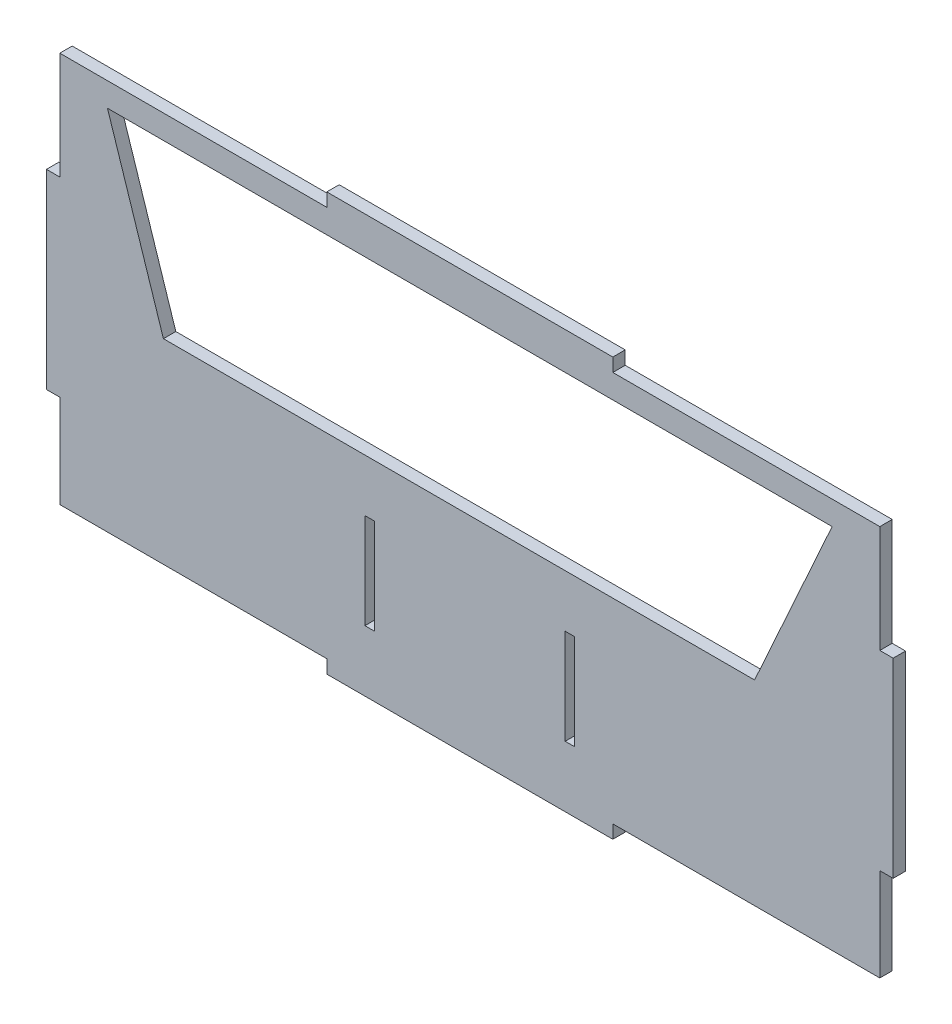
ISO-10303-21;
HEADER;
FILE_DESCRIPTION(('STEP AP214'),'2;1');
FILE_NAME('part.step','',(''),(''),'','','');
FILE_SCHEMA(('AUTOMOTIVE_DESIGN { 1 0 10303 214 1 1 1 1 }'));
ENDSEC;
DATA;
#1=APPLICATION_CONTEXT('core data for automotive mechanical design processes');
#2=APPLICATION_PROTOCOL_DEFINITION('international standard','automotive_design',2000,#1);
#3=PRODUCT_CONTEXT('',#1,'mechanical');
#4=PRODUCT('Part','Part','',(#3));
#5=PRODUCT_RELATED_PRODUCT_CATEGORY('part','',(#4));
#6=PRODUCT_DEFINITION_FORMATION('','',#4);
#7=PRODUCT_DEFINITION_CONTEXT('part definition',#1,'design');
#8=PRODUCT_DEFINITION('design','',#6,#7);
#9=PRODUCT_DEFINITION_SHAPE('','',#8);
#10=(LENGTH_UNIT() NAMED_UNIT(*) SI_UNIT(.MILLI.,.METRE.));
#11=(NAMED_UNIT(*) PLANE_ANGLE_UNIT() SI_UNIT($,.RADIAN.));
#12=(NAMED_UNIT(*) SI_UNIT($,.STERADIAN.) SOLID_ANGLE_UNIT());
#13=UNCERTAINTY_MEASURE_WITH_UNIT(LENGTH_MEASURE(1.E-05),#10,'distance_accuracy_value','');
#14=(GEOMETRIC_REPRESENTATION_CONTEXT(3) GLOBAL_UNCERTAINTY_ASSIGNED_CONTEXT((#13)) GLOBAL_UNIT_ASSIGNED_CONTEXT((#10,
#11,#12)) REPRESENTATION_CONTEXT('',''));
#15=CARTESIAN_POINT('',(0.,0.,0.));
#16=DIRECTION('',(0.,0.,1.));
#17=DIRECTION('',(1.,0.,0.));
#18=AXIS2_PLACEMENT_3D('',#15,#16,#17);
#19=CARTESIAN_POINT('',(-43.,-20.5,1.3));
#20=DIRECTION('',(0.,1.,0.));
#21=DIRECTION('',(0.,0.,1.));
#22=AXIS2_PLACEMENT_3D('',#19,#20,#21);
#23=PLANE('',#22);
#24=DIRECTION('',(0.,0.,1.));
#25=VECTOR('',#24,1.);
#26=CARTESIAN_POINT('',(15.,-20.5,0.));
#27=LINE('',#26,#25);
#28=CARTESIAN_POINT('',(15.,-20.5,0.));
#29=VERTEX_POINT('',#28);
#30=CARTESIAN_POINT('',(15.,-20.5,1.3));
#31=VERTEX_POINT('',#30);
#32=EDGE_CURVE('E325',#29,#31,#27,.T.);
#33=ORIENTED_EDGE('',*,*,#32,.F.);
#34=DIRECTION('',(1.,0.,0.));
#35=VECTOR('',#34,1.);
#36=CARTESIAN_POINT('',(-43.,-20.5,0.));
#37=LINE('',#36,#35);
#38=CARTESIAN_POINT('',(43.,-20.5,0.));
#39=VERTEX_POINT('',#38);
#40=EDGE_CURVE('E483',#29,#39,#37,.T.);
#41=ORIENTED_EDGE('',*,*,#40,.T.);
#42=DIRECTION('',(0.,0.,-1.));
#43=VECTOR('',#42,1.);
#44=CARTESIAN_POINT('',(43.,-20.5,1.3));
#45=LINE('',#44,#43);
#46=CARTESIAN_POINT('',(43.,-20.5,1.3));
#47=VERTEX_POINT('',#46);
#48=EDGE_CURVE('E471',#47,#39,#45,.T.);
#49=ORIENTED_EDGE('',*,*,#48,.F.);
#50=DIRECTION('',(1.,0.,0.));
#51=VECTOR('',#50,1.);
#52=CARTESIAN_POINT('',(-43.,-20.5,1.3));
#53=LINE('',#52,#51);
#54=EDGE_CURVE('E467',#31,#47,#53,.T.);
#55=ORIENTED_EDGE('',*,*,#54,.F.);
#56=EDGE_LOOP('',(#33,#41,#49,#55));
#57=FACE_BOUND('',#56,.T.);
#58=ADVANCED_FACE('F41',(#57),#23,.F.);
#59=CARTESIAN_POINT('',(-43.,20.5,1.3));
#60=DIRECTION('',(0.,-1.,0.));
#61=DIRECTION('',(0.,0.,-1.));
#62=AXIS2_PLACEMENT_3D('',#59,#60,#61);
#63=PLANE('',#62);
#64=DIRECTION('',(0.,0.,1.));
#65=VECTOR('',#64,1.);
#66=CARTESIAN_POINT('',(-15.,20.5,0.));
#67=LINE('',#66,#65);
#68=CARTESIAN_POINT('',(-15.,20.5,0.));
#69=VERTEX_POINT('',#68);
#70=CARTESIAN_POINT('',(-15.,20.5,1.3));
#71=VERTEX_POINT('',#70);
#72=EDGE_CURVE('E346',#69,#71,#67,.T.);
#73=ORIENTED_EDGE('',*,*,#72,.F.);
#74=DIRECTION('',(-1.,0.,0.));
#75=VECTOR('',#74,1.);
#76=CARTESIAN_POINT('',(-43.,20.5,0.));
#77=LINE('',#76,#75);
#78=CARTESIAN_POINT('',(-43.,20.5,0.));
#79=VERTEX_POINT('',#78);
#80=EDGE_CURVE('E475',#69,#79,#77,.T.);
#81=ORIENTED_EDGE('',*,*,#80,.T.);
#82=DIRECTION('',(0.,0.,-1.));
#83=VECTOR('',#82,1.);
#84=CARTESIAN_POINT('',(-43.,20.5,1.3));
#85=LINE('',#84,#83);
#86=CARTESIAN_POINT('',(-43.,20.5,1.3));
#87=VERTEX_POINT('',#86);
#88=EDGE_CURVE('E49',#87,#79,#85,.T.);
#89=ORIENTED_EDGE('',*,*,#88,.F.);
#90=DIRECTION('',(-1.,0.,0.));
#91=VECTOR('',#90,1.);
#92=CARTESIAN_POINT('',(-43.,20.5,1.3));
#93=LINE('',#92,#91);
#94=EDGE_CURVE('E458',#71,#87,#93,.T.);
#95=ORIENTED_EDGE('',*,*,#94,.F.);
#96=EDGE_LOOP('',(#73,#81,#89,#95));
#97=FACE_BOUND('',#96,.T.);
#98=ADVANCED_FACE('F515',(#97),#63,.F.);
#99=CARTESIAN_POINT('',(43.,-20.5,1.3));
#100=DIRECTION('',(-1.,0.,0.));
#101=DIRECTION('',(0.,0.,1.));
#102=AXIS2_PLACEMENT_3D('',#99,#100,#101);
#103=PLANE('',#102);
#104=DIRECTION('',(0.,0.,1.));
#105=VECTOR('',#104,1.);
#106=CARTESIAN_POINT('',(43.,9.25,0.));
#107=LINE('',#106,#105);
#108=CARTESIAN_POINT('',(43.,9.25,0.));
#109=VERTEX_POINT('',#108);
#110=CARTESIAN_POINT('',(43.,9.25,1.3));
#111=VERTEX_POINT('',#110);
#112=EDGE_CURVE('E365',#109,#111,#107,.T.);
#113=ORIENTED_EDGE('',*,*,#112,.F.);
#114=DIRECTION('',(0.,1.,0.));
#115=VECTOR('',#114,1.);
#116=CARTESIAN_POINT('',(43.,-20.5,0.));
#117=LINE('',#116,#115);
#118=CARTESIAN_POINT('',(43.,20.5,0.));
#119=VERTEX_POINT('',#118);
#120=EDGE_CURVE('E454',#109,#119,#117,.T.);
#121=ORIENTED_EDGE('',*,*,#120,.T.);
#122=DIRECTION('',(0.,0.,-1.));
#123=VECTOR('',#122,1.);
#124=CARTESIAN_POINT('',(43.,20.5,1.3));
#125=LINE('',#124,#123);
#126=CARTESIAN_POINT('',(43.,20.5,1.3));
#127=VERTEX_POINT('',#126);
#128=EDGE_CURVE('E11',#127,#119,#125,.T.);
#129=ORIENTED_EDGE('',*,*,#128,.F.);
#130=DIRECTION('',(0.,1.,0.));
#131=VECTOR('',#130,1.);
#132=CARTESIAN_POINT('',(43.,-20.5,1.3));
#133=LINE('',#132,#131);
#134=EDGE_CURVE('E459',#111,#127,#133,.T.);
#135=ORIENTED_EDGE('',*,*,#134,.F.);
#136=EDGE_LOOP('',(#113,#121,#129,#135));
#137=FACE_BOUND('',#136,.T.);
#138=ADVANCED_FACE('F534',(#137),#103,.F.);
#139=CARTESIAN_POINT('',(-43.,-20.5,1.3));
#140=DIRECTION('',(1.,0.,0.));
#141=DIRECTION('',(0.,0.,-1.));
#142=AXIS2_PLACEMENT_3D('',#139,#140,#141);
#143=PLANE('',#142);
#144=DIRECTION('',(0.,0.,1.));
#145=VECTOR('',#144,1.);
#146=CARTESIAN_POINT('',(-43.,-10.75,0.));
#147=LINE('',#146,#145);
#148=CARTESIAN_POINT('',(-43.,-10.75,0.));
#149=VERTEX_POINT('',#148);
#150=CARTESIAN_POINT('',(-43.,-10.75,1.3));
#151=VERTEX_POINT('',#150);
#152=EDGE_CURVE('E415',#149,#151,#147,.T.);
#153=ORIENTED_EDGE('',*,*,#152,.F.);
#154=DIRECTION('',(0.,-1.,0.));
#155=VECTOR('',#154,1.);
#156=CARTESIAN_POINT('',(-43.,-20.5,0.));
#157=LINE('',#156,#155);
#158=CARTESIAN_POINT('',(-43.,-20.5,0.));
#159=VERTEX_POINT('',#158);
#160=EDGE_CURVE('E479',#149,#159,#157,.T.);
#161=ORIENTED_EDGE('',*,*,#160,.T.);
#162=DIRECTION('',(0.,0.,-1.));
#163=VECTOR('',#162,1.);
#164=CARTESIAN_POINT('',(-43.,-20.5,1.3));
#165=LINE('',#164,#163);
#166=CARTESIAN_POINT('',(-43.,-20.5,1.3));
#167=VERTEX_POINT('',#166);
#168=EDGE_CURVE('E489',#167,#159,#165,.T.);
#169=ORIENTED_EDGE('',*,*,#168,.F.);
#170=DIRECTION('',(0.,-1.,0.));
#171=VECTOR('',#170,1.);
#172=CARTESIAN_POINT('',(-43.,-20.5,1.3));
#173=LINE('',#172,#171);
#174=EDGE_CURVE('E463',#151,#167,#173,.T.);
#175=ORIENTED_EDGE('',*,*,#174,.F.);
#176=EDGE_LOOP('',(#153,#161,#169,#175));
#177=FACE_BOUND('',#176,.T.);
#178=ADVANCED_FACE('F572',(#177),#143,.F.);
#179=CARTESIAN_POINT('',(0.,0.,1.3));
#180=DIRECTION('',(0.,0.,-1.));
#181=DIRECTION('',(-1.,0.,0.));
#182=AXIS2_PLACEMENT_3D('',#179,#180,#181);
#183=PLANE('',#182);
#184=DIRECTION('',(1.,0.,0.));
#185=VECTOR('',#184,1.);
#186=CARTESIAN_POINT('',(-11.,-15.5,1.3));
#187=LINE('',#186,#185);
#188=CARTESIAN_POINT('',(-11.,-15.5,1.3));
#189=VERTEX_POINT('',#188);
#190=CARTESIAN_POINT('',(-10.,-15.5,1.3));
#191=VERTEX_POINT('',#190);
#192=EDGE_CURVE('E280',#189,#191,#187,.T.);
#193=ORIENTED_EDGE('',*,*,#192,.F.);
#194=DIRECTION('',(0.,-1.,0.));
#195=VECTOR('',#194,1.);
#196=CARTESIAN_POINT('',(-11.,-5.5,1.3));
#197=LINE('',#196,#195);
#198=CARTESIAN_POINT('',(-11.,-5.5,1.3));
#199=VERTEX_POINT('',#198);
#200=EDGE_CURVE('E56',#199,#189,#197,.T.);
#201=ORIENTED_EDGE('',*,*,#200,.F.);
#202=DIRECTION('',(-1.,0.,0.));
#203=VECTOR('',#202,1.);
#204=CARTESIAN_POINT('',(-11.,-5.5,1.3));
#205=LINE('',#204,#203);
#206=CARTESIAN_POINT('',(-10.,-5.5,1.3));
#207=VERTEX_POINT('',#206);
#208=EDGE_CURVE('E271',#207,#199,#205,.T.);
#209=ORIENTED_EDGE('',*,*,#208,.F.);
#210=DIRECTION('',(0.,1.,0.));
#211=VECTOR('',#210,1.);
#212=CARTESIAN_POINT('',(-10.,-5.5,1.3));
#213=LINE('',#212,#211);
#214=EDGE_CURVE('E274',#191,#207,#213,.T.);
#215=ORIENTED_EDGE('',*,*,#214,.F.);
#216=EDGE_LOOP('',(#193,#201,#209,#215));
#217=FACE_BOUND('',#216,.T.);
#218=DIRECTION('',(1.,0.,0.));
#219=VECTOR('',#218,1.);
#220=CARTESIAN_POINT('',(9.99999999999999,-15.5,1.3));
#221=LINE('',#220,#219);
#222=CARTESIAN_POINT('',(9.99999999999999,-15.5,1.3));
#223=VERTEX_POINT('',#222);
#224=CARTESIAN_POINT('',(11.,-15.5,1.3));
#225=VERTEX_POINT('',#224);
#226=EDGE_CURVE('E306',#223,#225,#221,.T.);
#227=ORIENTED_EDGE('',*,*,#226,.F.);
#228=DIRECTION('',(0.,-1.,0.));
#229=VECTOR('',#228,1.);
#230=CARTESIAN_POINT('',(9.99999999999999,-5.5,1.3));
#231=LINE('',#230,#229);
#232=CARTESIAN_POINT('',(9.99999999999999,-5.5,1.3));
#233=VERTEX_POINT('',#232);
#234=EDGE_CURVE('E64',#233,#223,#231,.T.);
#235=ORIENTED_EDGE('',*,*,#234,.F.);
#236=DIRECTION('',(-1.,0.,0.));
#237=VECTOR('',#236,1.);
#238=CARTESIAN_POINT('',(9.99999999999999,-5.5,1.3));
#239=LINE('',#238,#237);
#240=CARTESIAN_POINT('',(11.,-5.5,1.3));
#241=VERTEX_POINT('',#240);
#242=EDGE_CURVE('E299',#241,#233,#239,.T.);
#243=ORIENTED_EDGE('',*,*,#242,.F.);
#244=DIRECTION('',(0.,1.,0.));
#245=VECTOR('',#244,1.);
#246=CARTESIAN_POINT('',(11.,-5.5,1.3));
#247=LINE('',#246,#245);
#248=EDGE_CURVE('E302',#225,#241,#247,.T.);
#249=ORIENTED_EDGE('',*,*,#248,.F.);
#250=EDGE_LOOP('',(#227,#235,#243,#249));
#251=FACE_BOUND('',#250,.T.);
#252=CARTESIAN_POINT('',(43.,-10.75,1.3));
#253=VERTEX_POINT('',#252);
#254=EDGE_CURVE('E455',#47,#253,#133,.T.);
#255=ORIENTED_EDGE('',*,*,#254,.T.);
#256=DIRECTION('',(1.,0.,0.));
#257=VECTOR('',#256,1.);
#258=CARTESIAN_POINT('',(43.,-10.75,1.3));
#259=LINE('',#258,#257);
#260=CARTESIAN_POINT('',(44.4,-10.75,1.3));
#261=VERTEX_POINT('',#260);
#262=EDGE_CURVE('E388',#253,#261,#259,.T.);
#263=ORIENTED_EDGE('',*,*,#262,.T.);
#264=DIRECTION('',(0.,1.,0.));
#265=VECTOR('',#264,1.);
#266=CARTESIAN_POINT('',(44.4,9.25,1.3));
#267=LINE('',#266,#265);
#268=CARTESIAN_POINT('',(44.4,9.25,1.3));
#269=VERTEX_POINT('',#268);
#270=EDGE_CURVE('E384',#261,#269,#267,.T.);
#271=ORIENTED_EDGE('',*,*,#270,.T.);
#272=DIRECTION('',(-1.,0.,0.));
#273=VECTOR('',#272,1.);
#274=CARTESIAN_POINT('',(43.,9.25,1.3));
#275=LINE('',#274,#273);
#276=EDGE_CURVE('E381',#269,#111,#275,.T.);
#277=ORIENTED_EDGE('',*,*,#276,.T.);
#278=ORIENTED_EDGE('',*,*,#134,.T.);
#279=CARTESIAN_POINT('',(15.,20.5,1.3));
#280=VERTEX_POINT('',#279);
#281=EDGE_CURVE('E460',#127,#280,#93,.T.);
#282=ORIENTED_EDGE('',*,*,#281,.T.);
#283=DIRECTION('',(0.,1.,0.));
#284=VECTOR('',#283,1.);
#285=CARTESIAN_POINT('',(15.,20.5,1.3));
#286=LINE('',#285,#284);
#287=CARTESIAN_POINT('',(15.,21.9,1.3));
#288=VERTEX_POINT('',#287);
#289=EDGE_CURVE('E358',#280,#288,#286,.T.);
#290=ORIENTED_EDGE('',*,*,#289,.T.);
#291=DIRECTION('',(-1.,0.,0.));
#292=VECTOR('',#291,1.);
#293=CARTESIAN_POINT('',(-15.,21.9,1.3));
#294=LINE('',#293,#292);
#295=CARTESIAN_POINT('',(-15.,21.9,1.3));
#296=VERTEX_POINT('',#295);
#297=EDGE_CURVE('E355',#288,#296,#294,.T.);
#298=ORIENTED_EDGE('',*,*,#297,.T.);
#299=DIRECTION('',(0.,-1.,0.));
#300=VECTOR('',#299,1.);
#301=CARTESIAN_POINT('',(-15.,20.5,1.3));
#302=LINE('',#301,#300);
#303=EDGE_CURVE('E362',#296,#71,#302,.T.);
#304=ORIENTED_EDGE('',*,*,#303,.T.);
#305=ORIENTED_EDGE('',*,*,#94,.T.);
#306=CARTESIAN_POINT('',(-43.,9.25000000000001,1.3));
#307=VERTEX_POINT('',#306);
#308=EDGE_CURVE('E464',#87,#307,#173,.T.);
#309=ORIENTED_EDGE('',*,*,#308,.T.);
#310=DIRECTION('',(-1.,0.,0.));
#311=VECTOR('',#310,1.);
#312=CARTESIAN_POINT('',(-43.,9.25,1.3));
#313=LINE('',#312,#311);
#314=CARTESIAN_POINT('',(-44.4,9.25,1.3));
#315=VERTEX_POINT('',#314);
#316=EDGE_CURVE('E391',#307,#315,#313,.T.);
#317=ORIENTED_EDGE('',*,*,#316,.T.);
#318=DIRECTION('',(0.,-1.,0.));
#319=VECTOR('',#318,1.);
#320=CARTESIAN_POINT('',(-44.4,9.25,1.3));
#321=LINE('',#320,#319);
#322=CARTESIAN_POINT('',(-44.4,-10.75,1.3));
#323=VERTEX_POINT('',#322);
#324=EDGE_CURVE('E410',#315,#323,#321,.T.);
#325=ORIENTED_EDGE('',*,*,#324,.T.);
#326=DIRECTION('',(1.,0.,0.));
#327=VECTOR('',#326,1.);
#328=CARTESIAN_POINT('',(-43.,-10.75,1.3));
#329=LINE('',#328,#327);
#330=EDGE_CURVE('E402',#323,#151,#329,.T.);
#331=ORIENTED_EDGE('',*,*,#330,.T.);
#332=ORIENTED_EDGE('',*,*,#174,.T.);
#333=CARTESIAN_POINT('',(-15.,-20.5,1.3));
#334=VERTEX_POINT('',#333);
#335=EDGE_CURVE('E468',#167,#334,#53,.T.);
#336=ORIENTED_EDGE('',*,*,#335,.T.);
#337=DIRECTION('',(0.,-1.,0.));
#338=VECTOR('',#337,1.);
#339=CARTESIAN_POINT('',(-15.,-20.5,1.3));
#340=LINE('',#339,#338);
#341=CARTESIAN_POINT('',(-15.,-21.9,1.3));
#342=VERTEX_POINT('',#341);
#343=EDGE_CURVE('E336',#334,#342,#340,.T.);
#344=ORIENTED_EDGE('',*,*,#343,.T.);
#345=DIRECTION('',(1.,0.,0.));
#346=VECTOR('',#345,1.);
#347=CARTESIAN_POINT('',(-15.,-21.9,1.3));
#348=LINE('',#347,#346);
#349=CARTESIAN_POINT('',(15.,-21.9,1.3));
#350=VERTEX_POINT('',#349);
#351=EDGE_CURVE('E332',#342,#350,#348,.T.);
#352=ORIENTED_EDGE('',*,*,#351,.T.);
#353=DIRECTION('',(0.,1.,0.));
#354=VECTOR('',#353,1.);
#355=CARTESIAN_POINT('',(15.,-20.5,1.3));
#356=LINE('',#355,#354);
#357=EDGE_CURVE('E329',#350,#31,#356,.T.);
#358=ORIENTED_EDGE('',*,*,#357,.T.);
#359=ORIENTED_EDGE('',*,*,#54,.T.);
#360=EDGE_LOOP('',(#255,#263,#271,#277,#278,#282,#290,#298,#304,#305,#309,#317,#325,#331,#332,
#336,#344,#352,#358,#359));
#361=FACE_BOUND('',#360,.T.);
#362=DIRECTION('',(0.309903013195301,-0.950768174905152,0.));
#363=VECTOR('',#362,1.);
#364=CARTESIAN_POINT('',(-32.1328976034858,0.,1.3));
#365=LINE('',#364,#363);
#366=CARTESIAN_POINT('',(-38.,18.,1.3));
#367=VERTEX_POINT('',#366);
#368=CARTESIAN_POINT('',(-32.1328976034858,0.,1.3));
#369=VERTEX_POINT('',#368);
#370=EDGE_CURVE('E424',#367,#369,#365,.T.);
#371=ORIENTED_EDGE('',*,*,#370,.F.);
#372=DIRECTION('',(-1.,0.,0.));
#373=VECTOR('',#372,1.);
#374=CARTESIAN_POINT('',(-38.,18.,1.3));
#375=LINE('',#374,#373);
#376=CARTESIAN_POINT('',(38.,18.,1.3));
#377=VERTEX_POINT('',#376);
#378=EDGE_CURVE('E432',#377,#367,#375,.T.);
#379=ORIENTED_EDGE('',*,*,#378,.F.);
#380=DIRECTION('',(0.411749257978006,0.911297179055527,0.));
#381=VECTOR('',#380,1.);
#382=CARTESIAN_POINT('',(38.,18.,1.3));
#383=LINE('',#382,#381);
#384=CARTESIAN_POINT('',(29.8671023965142,0.,1.3));
#385=VERTEX_POINT('',#384);
#386=EDGE_CURVE('E429',#385,#377,#383,.T.);
#387=ORIENTED_EDGE('',*,*,#386,.F.);
#388=DIRECTION('',(1.,0.,0.));
#389=VECTOR('',#388,1.);
#390=CARTESIAN_POINT('',(29.8671023965142,0.,1.3));
#391=LINE('',#390,#389);
#392=EDGE_CURVE('E426',#369,#385,#391,.T.);
#393=ORIENTED_EDGE('',*,*,#392,.F.);
#394=EDGE_LOOP('',(#371,#379,#387,#393));
#395=FACE_BOUND('',#394,.T.);
#396=ADVANCED_FACE('F511',(#217,#251,#361,#395),#183,.F.);
#397=CARTESIAN_POINT('',(0.,0.,0.));
#398=DIRECTION('',(0.,0.,-1.));
#399=DIRECTION('',(-1.,0.,0.));
#400=AXIS2_PLACEMENT_3D('',#397,#398,#399);
#401=PLANE('',#400);
#402=DIRECTION('',(0.,-1.,0.));
#403=VECTOR('',#402,1.);
#404=CARTESIAN_POINT('',(-11.,-5.5,0.));
#405=LINE('',#404,#403);
#406=CARTESIAN_POINT('',(-11.,-5.5,0.));
#407=VERTEX_POINT('',#406);
#408=CARTESIAN_POINT('',(-11.,-15.5,0.));
#409=VERTEX_POINT('',#408);
#410=EDGE_CURVE('E252',#407,#409,#405,.T.);
#411=ORIENTED_EDGE('',*,*,#410,.T.);
#412=DIRECTION('',(1.,0.,0.));
#413=VECTOR('',#412,1.);
#414=CARTESIAN_POINT('',(-11.,-15.5,0.));
#415=LINE('',#414,#413);
#416=CARTESIAN_POINT('',(-10.,-15.5,0.));
#417=VERTEX_POINT('',#416);
#418=EDGE_CURVE('E262',#409,#417,#415,.T.);
#419=ORIENTED_EDGE('',*,*,#418,.T.);
#420=DIRECTION('',(0.,1.,0.));
#421=VECTOR('',#420,1.);
#422=CARTESIAN_POINT('',(-10.,-5.5,0.));
#423=LINE('',#422,#421);
#424=CARTESIAN_POINT('',(-10.,-5.5,0.));
#425=VERTEX_POINT('',#424);
#426=EDGE_CURVE('E266',#417,#425,#423,.T.);
#427=ORIENTED_EDGE('',*,*,#426,.T.);
#428=DIRECTION('',(-1.,0.,0.));
#429=VECTOR('',#428,1.);
#430=CARTESIAN_POINT('',(-11.,-5.5,0.));
#431=LINE('',#430,#429);
#432=EDGE_CURVE('E258',#425,#407,#431,.T.);
#433=ORIENTED_EDGE('',*,*,#432,.T.);
#434=EDGE_LOOP('',(#411,#419,#427,#433));
#435=FACE_BOUND('',#434,.T.);
#436=DIRECTION('',(0.,-1.,0.));
#437=VECTOR('',#436,1.);
#438=CARTESIAN_POINT('',(9.99999999999999,-5.5,0.));
#439=LINE('',#438,#437);
#440=CARTESIAN_POINT('',(9.99999999999999,-5.5,0.));
#441=VERTEX_POINT('',#440);
#442=CARTESIAN_POINT('',(9.99999999999999,-15.5,0.));
#443=VERTEX_POINT('',#442);
#444=EDGE_CURVE('E303',#441,#443,#439,.T.);
#445=ORIENTED_EDGE('',*,*,#444,.T.);
#446=DIRECTION('',(1.,0.,0.));
#447=VECTOR('',#446,1.);
#448=CARTESIAN_POINT('',(9.99999999999999,-15.5,0.));
#449=LINE('',#448,#447);
#450=CARTESIAN_POINT('',(11.,-15.5,0.));
#451=VERTEX_POINT('',#450);
#452=EDGE_CURVE('E315',#443,#451,#449,.T.);
#453=ORIENTED_EDGE('',*,*,#452,.T.);
#454=DIRECTION('',(0.,1.,0.));
#455=VECTOR('',#454,1.);
#456=CARTESIAN_POINT('',(11.,-5.5,0.));
#457=LINE('',#456,#455);
#458=CARTESIAN_POINT('',(11.,-5.5,0.));
#459=VERTEX_POINT('',#458);
#460=EDGE_CURVE('E312',#451,#459,#457,.T.);
#461=ORIENTED_EDGE('',*,*,#460,.T.);
#462=DIRECTION('',(-1.,0.,0.));
#463=VECTOR('',#462,1.);
#464=CARTESIAN_POINT('',(9.99999999999999,-5.5,0.));
#465=LINE('',#464,#463);
#466=EDGE_CURVE('E292',#459,#441,#465,.T.);
#467=ORIENTED_EDGE('',*,*,#466,.T.);
#468=EDGE_LOOP('',(#445,#453,#461,#467));
#469=FACE_BOUND('',#468,.T.);
#470=CARTESIAN_POINT('',(43.,-10.75,0.));
#471=VERTEX_POINT('',#470);
#472=EDGE_CURVE('E472',#39,#471,#117,.T.);
#473=ORIENTED_EDGE('',*,*,#472,.F.);
#474=ORIENTED_EDGE('',*,*,#40,.F.);
#475=DIRECTION('',(0.,1.,0.));
#476=VECTOR('',#475,1.);
#477=CARTESIAN_POINT('',(15.,-20.5,0.));
#478=LINE('',#477,#476);
#479=CARTESIAN_POINT('',(15.,-21.9,0.));
#480=VERTEX_POINT('',#479);
#481=EDGE_CURVE('E322',#480,#29,#478,.T.);
#482=ORIENTED_EDGE('',*,*,#481,.F.);
#483=DIRECTION('',(1.,0.,0.));
#484=VECTOR('',#483,1.);
#485=CARTESIAN_POINT('',(-15.,-21.9,0.));
#486=LINE('',#485,#484);
#487=CARTESIAN_POINT('',(-15.,-21.9,0.));
#488=VERTEX_POINT('',#487);
#489=EDGE_CURVE('E341',#488,#480,#486,.T.);
#490=ORIENTED_EDGE('',*,*,#489,.F.);
#491=DIRECTION('',(0.,-1.,0.));
#492=VECTOR('',#491,1.);
#493=CARTESIAN_POINT('',(-15.,-20.5,0.));
#494=LINE('',#493,#492);
#495=CARTESIAN_POINT('',(-15.,-20.5,0.));
#496=VERTEX_POINT('',#495);
#497=EDGE_CURVE('E333',#496,#488,#494,.T.);
#498=ORIENTED_EDGE('',*,*,#497,.F.);
#499=EDGE_CURVE('E484',#159,#496,#37,.T.);
#500=ORIENTED_EDGE('',*,*,#499,.F.);
#501=ORIENTED_EDGE('',*,*,#160,.F.);
#502=DIRECTION('',(1.,0.,0.));
#503=VECTOR('',#502,1.);
#504=CARTESIAN_POINT('',(-43.,-10.75,0.));
#505=LINE('',#504,#503);
#506=CARTESIAN_POINT('',(-44.4,-10.75,0.));
#507=VERTEX_POINT('',#506);
#508=EDGE_CURVE('E405',#507,#149,#505,.T.);
#509=ORIENTED_EDGE('',*,*,#508,.F.);
#510=DIRECTION('',(0.,-1.,0.));
#511=VECTOR('',#510,1.);
#512=CARTESIAN_POINT('',(-44.4,9.25,0.));
#513=LINE('',#512,#511);
#514=CARTESIAN_POINT('',(-44.4,9.25,0.));
#515=VERTEX_POINT('',#514);
#516=EDGE_CURVE('E401',#515,#507,#513,.T.);
#517=ORIENTED_EDGE('',*,*,#516,.F.);
#518=DIRECTION('',(-1.,0.,0.));
#519=VECTOR('',#518,1.);
#520=CARTESIAN_POINT('',(-43.,9.25,0.));
#521=LINE('',#520,#519);
#522=CARTESIAN_POINT('',(-43.,9.25,0.));
#523=VERTEX_POINT('',#522);
#524=EDGE_CURVE('E398',#523,#515,#521,.T.);
#525=ORIENTED_EDGE('',*,*,#524,.F.);
#526=EDGE_CURVE('E480',#79,#523,#157,.T.);
#527=ORIENTED_EDGE('',*,*,#526,.F.);
#528=ORIENTED_EDGE('',*,*,#80,.F.);
#529=DIRECTION('',(0.,-1.,0.));
#530=VECTOR('',#529,1.);
#531=CARTESIAN_POINT('',(-15.,20.5,0.));
#532=LINE('',#531,#530);
#533=CARTESIAN_POINT('',(-15.,21.9,0.));
#534=VERTEX_POINT('',#533);
#535=EDGE_CURVE('E359',#534,#69,#532,.T.);
#536=ORIENTED_EDGE('',*,*,#535,.F.);
#537=DIRECTION('',(-1.,0.,0.));
#538=VECTOR('',#537,1.);
#539=CARTESIAN_POINT('',(-15.,21.9,0.));
#540=LINE('',#539,#538);
#541=CARTESIAN_POINT('',(15.,21.9,0.));
#542=VERTEX_POINT('',#541);
#543=EDGE_CURVE('E348',#542,#534,#540,.T.);
#544=ORIENTED_EDGE('',*,*,#543,.F.);
#545=DIRECTION('',(0.,1.,0.));
#546=VECTOR('',#545,1.);
#547=CARTESIAN_POINT('',(15.,20.5,0.));
#548=LINE('',#547,#546);
#549=CARTESIAN_POINT('',(15.,20.5,0.));
#550=VERTEX_POINT('',#549);
#551=EDGE_CURVE('E368',#550,#542,#548,.T.);
#552=ORIENTED_EDGE('',*,*,#551,.F.);
#553=EDGE_CURVE('E476',#119,#550,#77,.T.);
#554=ORIENTED_EDGE('',*,*,#553,.F.);
#555=ORIENTED_EDGE('',*,*,#120,.F.);
#556=DIRECTION('',(-1.,0.,0.));
#557=VECTOR('',#556,1.);
#558=CARTESIAN_POINT('',(43.,9.25,0.));
#559=LINE('',#558,#557);
#560=CARTESIAN_POINT('',(44.4,9.25,0.));
#561=VERTEX_POINT('',#560);
#562=EDGE_CURVE('E375',#561,#109,#559,.T.);
#563=ORIENTED_EDGE('',*,*,#562,.F.);
#564=DIRECTION('',(0.,1.,0.));
#565=VECTOR('',#564,1.);
#566=CARTESIAN_POINT('',(44.4,9.25,0.));
#567=LINE('',#566,#565);
#568=CARTESIAN_POINT('',(44.4,-10.75,0.));
#569=VERTEX_POINT('',#568);
#570=EDGE_CURVE('E393',#569,#561,#567,.T.);
#571=ORIENTED_EDGE('',*,*,#570,.F.);
#572=DIRECTION('',(1.,0.,0.));
#573=VECTOR('',#572,1.);
#574=CARTESIAN_POINT('',(43.,-10.75,0.));
#575=LINE('',#574,#573);
#576=EDGE_CURVE('E385',#471,#569,#575,.T.);
#577=ORIENTED_EDGE('',*,*,#576,.F.);
#578=EDGE_LOOP('',(#473,#474,#482,#490,#498,#500,#501,#509,#517,#525,#527,#528,#536,#544,#552,
#554,#555,#563,#571,#577));
#579=FACE_BOUND('',#578,.T.);
#580=DIRECTION('',(-1.,0.,0.));
#581=VECTOR('',#580,1.);
#582=CARTESIAN_POINT('',(-38.,18.,0.));
#583=LINE('',#582,#581);
#584=CARTESIAN_POINT('',(38.,18.,0.));
#585=VERTEX_POINT('',#584);
#586=CARTESIAN_POINT('',(-38.,18.,0.));
#587=VERTEX_POINT('',#586);
#588=EDGE_CURVE('E427',#585,#587,#583,.T.);
#589=ORIENTED_EDGE('',*,*,#588,.T.);
#590=DIRECTION('',(0.309903013195301,-0.950768174905152,0.));
#591=VECTOR('',#590,1.);
#592=CARTESIAN_POINT('',(-32.1328976034858,0.,0.));
#593=LINE('',#592,#591);
#594=CARTESIAN_POINT('',(-32.1328976034858,0.,0.));
#595=VERTEX_POINT('',#594);
#596=EDGE_CURVE('E417',#587,#595,#593,.T.);
#597=ORIENTED_EDGE('',*,*,#596,.T.);
#598=DIRECTION('',(1.,0.,0.));
#599=VECTOR('',#598,1.);
#600=CARTESIAN_POINT('',(29.8671023965142,0.,0.));
#601=LINE('',#600,#599);
#602=CARTESIAN_POINT('',(29.8671023965142,0.,0.));
#603=VERTEX_POINT('',#602);
#604=EDGE_CURVE('E437',#595,#603,#601,.T.);
#605=ORIENTED_EDGE('',*,*,#604,.T.);
#606=DIRECTION('',(0.411749257978006,0.911297179055527,0.));
#607=VECTOR('',#606,1.);
#608=CARTESIAN_POINT('',(38.,18.,0.));
#609=LINE('',#608,#607);
#610=EDGE_CURVE('E440',#603,#585,#609,.T.);
#611=ORIENTED_EDGE('',*,*,#610,.T.);
#612=EDGE_LOOP('',(#589,#597,#605,#611));
#613=FACE_BOUND('',#612,.T.);
#614=ADVANCED_FACE('F268',(#435,#469,#579,#613),#401,.T.);
#615=ORIENTED_EDGE('',*,*,#472,.T.);
#616=DIRECTION('',(0.,0.,1.));
#617=VECTOR('',#616,1.);
#618=CARTESIAN_POINT('',(43.,-10.75,0.));
#619=LINE('',#618,#617);
#620=EDGE_CURVE('E372',#471,#253,#619,.T.);
#621=ORIENTED_EDGE('',*,*,#620,.T.);
#622=ORIENTED_EDGE('',*,*,#254,.F.);
#623=ORIENTED_EDGE('',*,*,#48,.T.);
#624=EDGE_LOOP('',(#615,#621,#622,#623));
#625=FACE_BOUND('',#624,.T.);
#626=ADVANCED_FACE('F43',(#625),#103,.F.);
#627=ORIENTED_EDGE('',*,*,#553,.T.);
#628=DIRECTION('',(0.,0.,1.));
#629=VECTOR('',#628,1.);
#630=CARTESIAN_POINT('',(15.,20.5,0.));
#631=LINE('',#630,#629);
#632=EDGE_CURVE('E349',#550,#280,#631,.T.);
#633=ORIENTED_EDGE('',*,*,#632,.T.);
#634=ORIENTED_EDGE('',*,*,#281,.F.);
#635=ORIENTED_EDGE('',*,*,#128,.T.);
#636=EDGE_LOOP('',(#627,#633,#634,#635));
#637=FACE_BOUND('',#636,.T.);
#638=ADVANCED_FACE('F528',(#637),#63,.F.);
#639=ORIENTED_EDGE('',*,*,#526,.T.);
#640=DIRECTION('',(0.,0.,1.));
#641=VECTOR('',#640,1.);
#642=CARTESIAN_POINT('',(-43.,9.25,0.));
#643=LINE('',#642,#641);
#644=EDGE_CURVE('E407',#523,#307,#643,.T.);
#645=ORIENTED_EDGE('',*,*,#644,.T.);
#646=ORIENTED_EDGE('',*,*,#308,.F.);
#647=ORIENTED_EDGE('',*,*,#88,.T.);
#648=EDGE_LOOP('',(#639,#645,#646,#647));
#649=FACE_BOUND('',#648,.T.);
#650=ADVANCED_FACE('F496',(#649),#143,.F.);
#651=ORIENTED_EDGE('',*,*,#499,.T.);
#652=DIRECTION('',(0.,0.,1.));
#653=VECTOR('',#652,1.);
#654=CARTESIAN_POINT('',(-15.,-20.5,0.));
#655=LINE('',#654,#653);
#656=EDGE_CURVE('E286',#496,#334,#655,.T.);
#657=ORIENTED_EDGE('',*,*,#656,.T.);
#658=ORIENTED_EDGE('',*,*,#335,.F.);
#659=ORIENTED_EDGE('',*,*,#168,.T.);
#660=EDGE_LOOP('',(#651,#657,#658,#659));
#661=FACE_BOUND('',#660,.T.);
#662=ADVANCED_FACE('F566',(#661),#23,.F.);
#663=CARTESIAN_POINT('',(-32.1328976034858,0.,1.3));
#664=DIRECTION('',(0.950768174905152,0.309903013195301,0.));
#665=DIRECTION('',(-0.309903013195301,0.950768174905152,0.));
#666=AXIS2_PLACEMENT_3D('',#663,#664,#665);
#667=PLANE('',#666);
#668=ORIENTED_EDGE('',*,*,#596,.F.);
#669=DIRECTION('',(0.,0.,-1.));
#670=VECTOR('',#669,1.);
#671=CARTESIAN_POINT('',(-38.,18.,1.3));
#672=LINE('',#671,#670);
#673=EDGE_CURVE('E434',#367,#587,#672,.T.);
#674=ORIENTED_EDGE('',*,*,#673,.F.);
#675=ORIENTED_EDGE('',*,*,#370,.T.);
#676=DIRECTION('',(0.,0.,-1.));
#677=VECTOR('',#676,1.);
#678=CARTESIAN_POINT('',(-32.1328976034858,0.,1.3));
#679=LINE('',#678,#677);
#680=EDGE_CURVE('E451',#369,#595,#679,.T.);
#681=ORIENTED_EDGE('',*,*,#680,.T.);
#682=EDGE_LOOP('',(#668,#674,#675,#681));
#683=FACE_BOUND('',#682,.T.);
#684=ADVANCED_FACE('F597',(#683),#667,.T.);
#685=CARTESIAN_POINT('',(29.8671023965142,0.,1.3));
#686=DIRECTION('',(0.,1.,0.));
#687=DIRECTION('',(0.,0.,1.));
#688=AXIS2_PLACEMENT_3D('',#685,#686,#687);
#689=PLANE('',#688);
#690=ORIENTED_EDGE('',*,*,#604,.F.);
#691=ORIENTED_EDGE('',*,*,#680,.F.);
#692=ORIENTED_EDGE('',*,*,#392,.T.);
#693=DIRECTION('',(0.,0.,-1.));
#694=VECTOR('',#693,1.);
#695=CARTESIAN_POINT('',(29.8671023965142,0.,1.3));
#696=LINE('',#695,#694);
#697=EDGE_CURVE('E449',#385,#603,#696,.T.);
#698=ORIENTED_EDGE('',*,*,#697,.T.);
#699=EDGE_LOOP('',(#690,#691,#692,#698));
#700=FACE_BOUND('',#699,.T.);
#701=ADVANCED_FACE('F602',(#700),#689,.T.);
#702=CARTESIAN_POINT('',(38.,18.,1.3));
#703=DIRECTION('',(-0.911297179055527,0.411749257978006,0.));
#704=DIRECTION('',(-0.411749257978006,-0.911297179055527,0.));
#705=AXIS2_PLACEMENT_3D('',#702,#703,#704);
#706=PLANE('',#705);
#707=ORIENTED_EDGE('',*,*,#610,.F.);
#708=ORIENTED_EDGE('',*,*,#697,.F.);
#709=ORIENTED_EDGE('',*,*,#386,.T.);
#710=DIRECTION('',(0.,0.,-1.));
#711=VECTOR('',#710,1.);
#712=CARTESIAN_POINT('',(38.,18.,1.3));
#713=LINE('',#712,#711);
#714=EDGE_CURVE('E447',#377,#585,#713,.T.);
#715=ORIENTED_EDGE('',*,*,#714,.T.);
#716=EDGE_LOOP('',(#707,#708,#709,#715));
#717=FACE_BOUND('',#716,.T.);
#718=ADVANCED_FACE('F626',(#717),#706,.T.);
#719=CARTESIAN_POINT('',(-38.,18.,1.3));
#720=DIRECTION('',(0.,-1.,0.));
#721=DIRECTION('',(1.,0.,0.));
#722=AXIS2_PLACEMENT_3D('',#719,#720,#721);
#723=PLANE('',#722);
#724=ORIENTED_EDGE('',*,*,#588,.F.);
#725=ORIENTED_EDGE('',*,*,#714,.F.);
#726=ORIENTED_EDGE('',*,*,#378,.T.);
#727=ORIENTED_EDGE('',*,*,#673,.T.);
#728=EDGE_LOOP('',(#724,#725,#726,#727));
#729=FACE_BOUND('',#728,.T.);
#730=ADVANCED_FACE('F630',(#729),#723,.T.);
#731=CARTESIAN_POINT('',(-43.,-10.75,0.));
#732=DIRECTION('',(0.,-1.,0.));
#733=DIRECTION('',(0.,0.,-1.));
#734=AXIS2_PLACEMENT_3D('',#731,#732,#733);
#735=PLANE('',#734);
#736=ORIENTED_EDGE('',*,*,#330,.F.);
#737=DIRECTION('',(0.,0.,1.));
#738=VECTOR('',#737,1.);
#739=CARTESIAN_POINT('',(-44.4,-10.75,0.));
#740=LINE('',#739,#738);
#741=EDGE_CURVE('E418',#507,#323,#740,.T.);
#742=ORIENTED_EDGE('',*,*,#741,.F.);
#743=ORIENTED_EDGE('',*,*,#508,.T.);
#744=ORIENTED_EDGE('',*,*,#152,.T.);
#745=EDGE_LOOP('',(#736,#742,#743,#744));
#746=FACE_BOUND('',#745,.T.);
#747=ADVANCED_FACE('F575',(#746),#735,.T.);
#748=CARTESIAN_POINT('',(-44.4,9.25,0.));
#749=DIRECTION('',(-1.,0.,0.));
#750=DIRECTION('',(0.,-1.,0.));
#751=AXIS2_PLACEMENT_3D('',#748,#749,#750);
#752=PLANE('',#751);
#753=ORIENTED_EDGE('',*,*,#324,.F.);
#754=DIRECTION('',(0.,0.,1.));
#755=VECTOR('',#754,1.);
#756=CARTESIAN_POINT('',(-44.4,9.25,0.));
#757=LINE('',#756,#755);
#758=EDGE_CURVE('E420',#515,#315,#757,.T.);
#759=ORIENTED_EDGE('',*,*,#758,.F.);
#760=ORIENTED_EDGE('',*,*,#516,.T.);
#761=ORIENTED_EDGE('',*,*,#741,.T.);
#762=EDGE_LOOP('',(#753,#759,#760,#761));
#763=FACE_BOUND('',#762,.T.);
#764=ADVANCED_FACE('F577',(#763),#752,.T.);
#765=CARTESIAN_POINT('',(-43.,9.25,0.));
#766=DIRECTION('',(0.,1.,0.));
#767=DIRECTION('',(-1.,0.,0.));
#768=AXIS2_PLACEMENT_3D('',#765,#766,#767);
#769=PLANE('',#768);
#770=ORIENTED_EDGE('',*,*,#316,.F.);
#771=ORIENTED_EDGE('',*,*,#644,.F.);
#772=ORIENTED_EDGE('',*,*,#524,.T.);
#773=ORIENTED_EDGE('',*,*,#758,.T.);
#774=EDGE_LOOP('',(#770,#771,#772,#773));
#775=FACE_BOUND('',#774,.T.);
#776=ADVANCED_FACE('F508',(#775),#769,.T.);
#777=CARTESIAN_POINT('',(43.,9.25,0.));
#778=DIRECTION('',(0.,1.,0.));
#779=DIRECTION('',(-1.,0.,0.));
#780=AXIS2_PLACEMENT_3D('',#777,#778,#779);
#781=PLANE('',#780);
#782=ORIENTED_EDGE('',*,*,#276,.F.);
#783=DIRECTION('',(0.,0.,1.));
#784=VECTOR('',#783,1.);
#785=CARTESIAN_POINT('',(44.4,9.25,0.));
#786=LINE('',#785,#784);
#787=EDGE_CURVE('E378',#561,#269,#786,.T.);
#788=ORIENTED_EDGE('',*,*,#787,.F.);
#789=ORIENTED_EDGE('',*,*,#562,.T.);
#790=ORIENTED_EDGE('',*,*,#112,.T.);
#791=EDGE_LOOP('',(#782,#788,#789,#790));
#792=FACE_BOUND('',#791,.T.);
#793=ADVANCED_FACE('F540',(#792),#781,.T.);
#794=CARTESIAN_POINT('',(44.4,9.25,0.));
#795=DIRECTION('',(1.,0.,0.));
#796=DIRECTION('',(0.,0.,-1.));
#797=AXIS2_PLACEMENT_3D('',#794,#795,#796);
#798=PLANE('',#797);
#799=ORIENTED_EDGE('',*,*,#270,.F.);
#800=DIRECTION('',(0.,0.,1.));
#801=VECTOR('',#800,1.);
#802=CARTESIAN_POINT('',(44.4,-10.75,0.));
#803=LINE('',#802,#801);
#804=EDGE_CURVE('E376',#569,#261,#803,.T.);
#805=ORIENTED_EDGE('',*,*,#804,.F.);
#806=ORIENTED_EDGE('',*,*,#570,.T.);
#807=ORIENTED_EDGE('',*,*,#787,.T.);
#808=EDGE_LOOP('',(#799,#805,#806,#807));
#809=FACE_BOUND('',#808,.T.);
#810=ADVANCED_FACE('F543',(#809),#798,.T.);
#811=CARTESIAN_POINT('',(43.,-10.75,0.));
#812=DIRECTION('',(0.,-1.,0.));
#813=DIRECTION('',(0.,0.,-1.));
#814=AXIS2_PLACEMENT_3D('',#811,#812,#813);
#815=PLANE('',#814);
#816=ORIENTED_EDGE('',*,*,#262,.F.);
#817=ORIENTED_EDGE('',*,*,#620,.F.);
#818=ORIENTED_EDGE('',*,*,#576,.T.);
#819=ORIENTED_EDGE('',*,*,#804,.T.);
#820=EDGE_LOOP('',(#816,#817,#818,#819));
#821=FACE_BOUND('',#820,.T.);
#822=ADVANCED_FACE('F545',(#821),#815,.T.);
#823=CARTESIAN_POINT('',(-15.,20.5,0.));
#824=DIRECTION('',(-1.,0.,0.));
#825=DIRECTION('',(0.,0.,1.));
#826=AXIS2_PLACEMENT_3D('',#823,#824,#825);
#827=PLANE('',#826);
#828=ORIENTED_EDGE('',*,*,#303,.F.);
#829=DIRECTION('',(0.,0.,1.));
#830=VECTOR('',#829,1.);
#831=CARTESIAN_POINT('',(-15.,21.9,0.));
#832=LINE('',#831,#830);
#833=EDGE_CURVE('E339',#534,#296,#832,.T.);
#834=ORIENTED_EDGE('',*,*,#833,.F.);
#835=ORIENTED_EDGE('',*,*,#535,.T.);
#836=ORIENTED_EDGE('',*,*,#72,.T.);
#837=EDGE_LOOP('',(#828,#834,#835,#836));
#838=FACE_BOUND('',#837,.T.);
#839=ADVANCED_FACE('F517',(#838),#827,.T.);
#840=CARTESIAN_POINT('',(-15.,21.9,0.));
#841=DIRECTION('',(0.,1.,0.));
#842=DIRECTION('',(0.,0.,1.));
#843=AXIS2_PLACEMENT_3D('',#840,#841,#842);
#844=PLANE('',#843);
#845=ORIENTED_EDGE('',*,*,#297,.F.);
#846=DIRECTION('',(0.,0.,1.));
#847=VECTOR('',#846,1.);
#848=CARTESIAN_POINT('',(15.,21.9,0.));
#849=LINE('',#848,#847);
#850=EDGE_CURVE('E352',#542,#288,#849,.T.);
#851=ORIENTED_EDGE('',*,*,#850,.F.);
#852=ORIENTED_EDGE('',*,*,#543,.T.);
#853=ORIENTED_EDGE('',*,*,#833,.T.);
#854=EDGE_LOOP('',(#845,#851,#852,#853));
#855=FACE_BOUND('',#854,.T.);
#856=ADVANCED_FACE('F522',(#855),#844,.T.);
#857=CARTESIAN_POINT('',(15.,20.5,0.));
#858=DIRECTION('',(1.,0.,0.));
#859=DIRECTION('',(0.,0.,-1.));
#860=AXIS2_PLACEMENT_3D('',#857,#858,#859);
#861=PLANE('',#860);
#862=ORIENTED_EDGE('',*,*,#289,.F.);
#863=ORIENTED_EDGE('',*,*,#632,.F.);
#864=ORIENTED_EDGE('',*,*,#551,.T.);
#865=ORIENTED_EDGE('',*,*,#850,.T.);
#866=EDGE_LOOP('',(#862,#863,#864,#865));
#867=FACE_BOUND('',#866,.T.);
#868=ADVANCED_FACE('F524',(#867),#861,.T.);
#869=CARTESIAN_POINT('',(-15.,-20.5,0.));
#870=DIRECTION('',(-1.,0.,0.));
#871=DIRECTION('',(0.,0.,1.));
#872=AXIS2_PLACEMENT_3D('',#869,#870,#871);
#873=PLANE('',#872);
#874=ORIENTED_EDGE('',*,*,#343,.F.);
#875=ORIENTED_EDGE('',*,*,#656,.F.);
#876=ORIENTED_EDGE('',*,*,#497,.T.);
#877=DIRECTION('',(0.,0.,1.));
#878=VECTOR('',#877,1.);
#879=CARTESIAN_POINT('',(-15.,-21.9,0.));
#880=LINE('',#879,#878);
#881=EDGE_CURVE('E320',#488,#342,#880,.T.);
#882=ORIENTED_EDGE('',*,*,#881,.T.);
#883=EDGE_LOOP('',(#874,#875,#876,#882));
#884=FACE_BOUND('',#883,.T.);
#885=ADVANCED_FACE('F562',(#884),#873,.T.);
#886=CARTESIAN_POINT('',(15.,-20.5,0.));
#887=DIRECTION('',(1.,0.,0.));
#888=DIRECTION('',(0.,0.,-1.));
#889=AXIS2_PLACEMENT_3D('',#886,#887,#888);
#890=PLANE('',#889);
#891=ORIENTED_EDGE('',*,*,#357,.F.);
#892=DIRECTION('',(0.,0.,1.));
#893=VECTOR('',#892,1.);
#894=CARTESIAN_POINT('',(15.,-21.9,0.));
#895=LINE('',#894,#893);
#896=EDGE_CURVE('E323',#480,#350,#895,.T.);
#897=ORIENTED_EDGE('',*,*,#896,.F.);
#898=ORIENTED_EDGE('',*,*,#481,.T.);
#899=ORIENTED_EDGE('',*,*,#32,.T.);
#900=EDGE_LOOP('',(#891,#897,#898,#899));
#901=FACE_BOUND('',#900,.T.);
#902=ADVANCED_FACE('F578',(#901),#890,.T.);
#903=CARTESIAN_POINT('',(-15.,-21.9,0.));
#904=DIRECTION('',(0.,-1.,0.));
#905=DIRECTION('',(1.,0.,0.));
#906=AXIS2_PLACEMENT_3D('',#903,#904,#905);
#907=PLANE('',#906);
#908=ORIENTED_EDGE('',*,*,#351,.F.);
#909=ORIENTED_EDGE('',*,*,#881,.F.);
#910=ORIENTED_EDGE('',*,*,#489,.T.);
#911=ORIENTED_EDGE('',*,*,#896,.T.);
#912=EDGE_LOOP('',(#908,#909,#910,#911));
#913=FACE_BOUND('',#912,.T.);
#914=ADVANCED_FACE('F559',(#913),#907,.T.);
#915=CARTESIAN_POINT('',(9.99999999999999,-5.5,0.));
#916=DIRECTION('',(-1.,0.,0.));
#917=DIRECTION('',(0.,-1.,0.));
#918=AXIS2_PLACEMENT_3D('',#915,#916,#917);
#919=PLANE('',#918);
#920=ORIENTED_EDGE('',*,*,#234,.T.);
#921=DIRECTION('',(0.,0.,1.));
#922=VECTOR('',#921,1.);
#923=CARTESIAN_POINT('',(9.99999999999999,-15.5,0.));
#924=LINE('',#923,#922);
#925=EDGE_CURVE('E290',#443,#223,#924,.T.);
#926=ORIENTED_EDGE('',*,*,#925,.F.);
#927=ORIENTED_EDGE('',*,*,#444,.F.);
#928=DIRECTION('',(0.,0.,1.));
#929=VECTOR('',#928,1.);
#930=CARTESIAN_POINT('',(9.99999999999999,-5.5,0.));
#931=LINE('',#930,#929);
#932=EDGE_CURVE('E297',#441,#233,#931,.T.);
#933=ORIENTED_EDGE('',*,*,#932,.T.);
#934=EDGE_LOOP('',(#920,#926,#927,#933));
#935=FACE_BOUND('',#934,.T.);
#936=ADVANCED_FACE('F585',(#935),#919,.F.);
#937=CARTESIAN_POINT('',(9.99999999999999,-5.5,0.));
#938=DIRECTION('',(0.,1.,0.));
#939=DIRECTION('',(-1.,0.,0.));
#940=AXIS2_PLACEMENT_3D('',#937,#938,#939);
#941=PLANE('',#940);
#942=ORIENTED_EDGE('',*,*,#242,.T.);
#943=ORIENTED_EDGE('',*,*,#932,.F.);
#944=ORIENTED_EDGE('',*,*,#466,.F.);
#945=DIRECTION('',(0.,0.,1.));
#946=VECTOR('',#945,1.);
#947=CARTESIAN_POINT('',(11.,-5.5,0.));
#948=LINE('',#947,#946);
#949=EDGE_CURVE('E295',#459,#241,#948,.T.);
#950=ORIENTED_EDGE('',*,*,#949,.T.);
#951=EDGE_LOOP('',(#942,#943,#944,#950));
#952=FACE_BOUND('',#951,.T.);
#953=ADVANCED_FACE('F703',(#952),#941,.F.);
#954=CARTESIAN_POINT('',(11.,-5.5,0.));
#955=DIRECTION('',(1.,0.,0.));
#956=DIRECTION('',(0.,1.,0.));
#957=AXIS2_PLACEMENT_3D('',#954,#955,#956);
#958=PLANE('',#957);
#959=ORIENTED_EDGE('',*,*,#248,.T.);
#960=ORIENTED_EDGE('',*,*,#949,.F.);
#961=ORIENTED_EDGE('',*,*,#460,.F.);
#962=DIRECTION('',(0.,0.,1.));
#963=VECTOR('',#962,1.);
#964=CARTESIAN_POINT('',(11.,-15.5,0.));
#965=LINE('',#964,#963);
#966=EDGE_CURVE('E293',#451,#225,#965,.T.);
#967=ORIENTED_EDGE('',*,*,#966,.T.);
#968=EDGE_LOOP('',(#959,#960,#961,#967));
#969=FACE_BOUND('',#968,.T.);
#970=ADVANCED_FACE('F713',(#969),#958,.F.);
#971=CARTESIAN_POINT('',(9.99999999999999,-15.5,0.));
#972=DIRECTION('',(0.,-1.,0.));
#973=DIRECTION('',(0.,0.,-1.));
#974=AXIS2_PLACEMENT_3D('',#971,#972,#973);
#975=PLANE('',#974);
#976=ORIENTED_EDGE('',*,*,#226,.T.);
#977=ORIENTED_EDGE('',*,*,#966,.F.);
#978=ORIENTED_EDGE('',*,*,#452,.F.);
#979=ORIENTED_EDGE('',*,*,#925,.T.);
#980=EDGE_LOOP('',(#976,#977,#978,#979));
#981=FACE_BOUND('',#980,.T.);
#982=ADVANCED_FACE('F724',(#981),#975,.F.);
#983=CARTESIAN_POINT('',(-11.,-5.5,0.));
#984=DIRECTION('',(-1.,0.,0.));
#985=DIRECTION('',(0.,0.,1.));
#986=AXIS2_PLACEMENT_3D('',#983,#984,#985);
#987=PLANE('',#986);
#988=ORIENTED_EDGE('',*,*,#200,.T.);
#989=DIRECTION('',(0.,0.,1.));
#990=VECTOR('',#989,1.);
#991=CARTESIAN_POINT('',(-11.,-15.5,0.));
#992=LINE('',#991,#990);
#993=EDGE_CURVE('E248',#409,#189,#992,.T.);
#994=ORIENTED_EDGE('',*,*,#993,.F.);
#995=ORIENTED_EDGE('',*,*,#410,.F.);
#996=DIRECTION('',(0.,0.,1.));
#997=VECTOR('',#996,1.);
#998=CARTESIAN_POINT('',(-11.,-5.5,0.));
#999=LINE('',#998,#997);
#1000=EDGE_CURVE('E284',#407,#199,#999,.T.);
#1001=ORIENTED_EDGE('',*,*,#1000,.T.);
#1002=EDGE_LOOP('',(#988,#994,#995,#1001));
#1003=FACE_BOUND('',#1002,.T.);
#1004=ADVANCED_FACE('F250',(#1003),#987,.F.);
#1005=CARTESIAN_POINT('',(-11.,-5.5,0.));
#1006=DIRECTION('',(0.,1.,0.));
#1007=DIRECTION('',(0.,0.,1.));
#1008=AXIS2_PLACEMENT_3D('',#1005,#1006,#1007);
#1009=PLANE('',#1008);
#1010=ORIENTED_EDGE('',*,*,#208,.T.);
#1011=ORIENTED_EDGE('',*,*,#1000,.F.);
#1012=ORIENTED_EDGE('',*,*,#432,.F.);
#1013=DIRECTION('',(0.,0.,1.));
#1014=VECTOR('',#1013,1.);
#1015=CARTESIAN_POINT('',(-10.,-5.5,0.));
#1016=LINE('',#1015,#1014);
#1017=EDGE_CURVE('E287',#425,#207,#1016,.T.);
#1018=ORIENTED_EDGE('',*,*,#1017,.T.);
#1019=EDGE_LOOP('',(#1010,#1011,#1012,#1018));
#1020=FACE_BOUND('',#1019,.T.);
#1021=ADVANCED_FACE('F745',(#1020),#1009,.F.);
#1022=CARTESIAN_POINT('',(-10.,-5.5,0.));
#1023=DIRECTION('',(1.,0.,0.));
#1024=DIRECTION('',(0.,1.,0.));
#1025=AXIS2_PLACEMENT_3D('',#1022,#1023,#1024);
#1026=PLANE('',#1025);
#1027=ORIENTED_EDGE('',*,*,#214,.T.);
#1028=ORIENTED_EDGE('',*,*,#1017,.F.);
#1029=ORIENTED_EDGE('',*,*,#426,.F.);
#1030=DIRECTION('',(0.,0.,1.));
#1031=VECTOR('',#1030,1.);
#1032=CARTESIAN_POINT('',(-10.,-15.5,0.));
#1033=LINE('',#1032,#1031);
#1034=EDGE_CURVE('E257',#417,#191,#1033,.T.);
#1035=ORIENTED_EDGE('',*,*,#1034,.T.);
#1036=EDGE_LOOP('',(#1027,#1028,#1029,#1035));
#1037=FACE_BOUND('',#1036,.T.);
#1038=ADVANCED_FACE('F755',(#1037),#1026,.F.);
#1039=CARTESIAN_POINT('',(-11.,-15.5,0.));
#1040=DIRECTION('',(0.,-1.,0.));
#1041=DIRECTION('',(1.,0.,0.));
#1042=AXIS2_PLACEMENT_3D('',#1039,#1040,#1041);
#1043=PLANE('',#1042);
#1044=ORIENTED_EDGE('',*,*,#192,.T.);
#1045=ORIENTED_EDGE('',*,*,#1034,.F.);
#1046=ORIENTED_EDGE('',*,*,#418,.F.);
#1047=ORIENTED_EDGE('',*,*,#993,.T.);
#1048=EDGE_LOOP('',(#1044,#1045,#1046,#1047));
#1049=FACE_BOUND('',#1048,.T.);
#1050=ADVANCED_FACE('F263',(#1049),#1043,.F.);
#1051=CLOSED_SHELL('',(#58,#98,#138,#178,#396,#614,#626,#638,#650,#662,#684,#701,#718,#730,#747,
#764,#776,#793,#810,#822,#839,#856,#868,#885,#902,#914,#936,#953,#970,#982,#1004,#1021,#1038,#1050));
#1052=MANIFOLD_SOLID_BREP('B2',#1051);
#1053=ADVANCED_BREP_SHAPE_REPRESENTATION('',(#18,#1052),#14);
#1054=SHAPE_DEFINITION_REPRESENTATION(#9,#1053);
ENDSEC;
END-ISO-10303-21;
